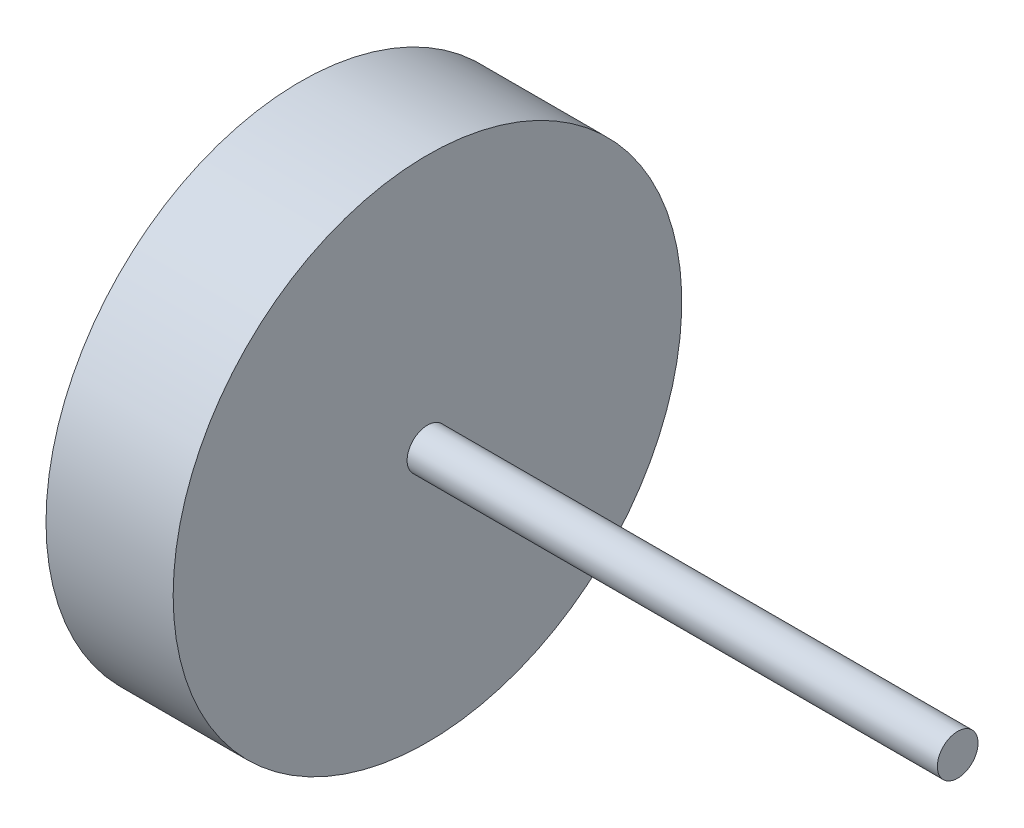
ISO-10303-21;
HEADER;
FILE_DESCRIPTION(('STEP AP214'),'2;1');
FILE_NAME('part.step','',(''),(''),'','','');
FILE_SCHEMA(('AUTOMOTIVE_DESIGN { 1 0 10303 214 1 1 1 1 }'));
ENDSEC;
DATA;
#1=APPLICATION_CONTEXT('core data for automotive mechanical design processes');
#2=APPLICATION_PROTOCOL_DEFINITION('international standard','automotive_design',2000,#1);
#3=PRODUCT_CONTEXT('',#1,'mechanical');
#4=PRODUCT('Part','Part','',(#3));
#5=PRODUCT_RELATED_PRODUCT_CATEGORY('part','',(#4));
#6=PRODUCT_DEFINITION_FORMATION('','',#4);
#7=PRODUCT_DEFINITION_CONTEXT('part definition',#1,'design');
#8=PRODUCT_DEFINITION('design','',#6,#7);
#9=PRODUCT_DEFINITION_SHAPE('','',#8);
#10=(LENGTH_UNIT() NAMED_UNIT(*) SI_UNIT(.MILLI.,.METRE.));
#11=(NAMED_UNIT(*) PLANE_ANGLE_UNIT() SI_UNIT($,.RADIAN.));
#12=(NAMED_UNIT(*) SI_UNIT($,.STERADIAN.) SOLID_ANGLE_UNIT());
#13=UNCERTAINTY_MEASURE_WITH_UNIT(LENGTH_MEASURE(1.E-05),#10,'distance_accuracy_value','');
#14=(GEOMETRIC_REPRESENTATION_CONTEXT(3) GLOBAL_UNCERTAINTY_ASSIGNED_CONTEXT((#13)) GLOBAL_UNIT_ASSIGNED_CONTEXT((#10,
#11,#12)) REPRESENTATION_CONTEXT('',''));
#15=CARTESIAN_POINT('',(0.,0.,0.));
#16=DIRECTION('',(0.,0.,1.));
#17=DIRECTION('',(1.,0.,0.));
#18=AXIS2_PLACEMENT_3D('',#15,#16,#17);
#19=CARTESIAN_POINT('',(-115.25,0.,-252.75));
#20=DIRECTION('',(-1.,0.,0.));
#21=DIRECTION('',(0.,0.,1.));
#22=AXIS2_PLACEMENT_3D('',#19,#20,#21);
#23=CYLINDRICAL_SURFACE('',#22,50.);
#24=CARTESIAN_POINT('',(-115.25,0.,-252.75));
#25=DIRECTION('',(-1.,0.,0.));
#26=DIRECTION('',(0.,0.,1.));
#27=AXIS2_PLACEMENT_3D('',#24,#25,#26);
#28=CIRCLE('',#27,50.);
#29=CARTESIAN_POINT('',(-115.25,0.,-202.75));
#30=VERTEX_POINT('',#29);
#31=EDGE_CURVE('E10',#30,#30,#28,.T.);
#32=ORIENTED_EDGE('',*,*,#31,.T.);
#33=EDGE_LOOP('',(#32));
#34=FACE_BOUND('',#33,.T.);
#35=CARTESIAN_POINT('',(-140.25,0.,-252.75));
#36=DIRECTION('',(-1.,0.,0.));
#37=DIRECTION('',(0.,0.,1.));
#38=AXIS2_PLACEMENT_3D('',#35,#36,#37);
#39=CIRCLE('',#38,50.);
#40=CARTESIAN_POINT('',(-140.25,0.,-202.75));
#41=VERTEX_POINT('',#40);
#42=EDGE_CURVE('E46',#41,#41,#39,.T.);
#43=ORIENTED_EDGE('',*,*,#42,.F.);
#44=EDGE_LOOP('',(#43));
#45=FACE_BOUND('',#44,.T.);
#46=ADVANCED_FACE('F43',(#34,#45),#23,.T.);
#47=CARTESIAN_POINT('',(-115.25,0.,-252.75));
#48=DIRECTION('',(-1.,0.,0.));
#49=DIRECTION('',(0.,0.,1.));
#50=AXIS2_PLACEMENT_3D('',#47,#48,#49);
#51=PLANE('',#50);
#52=CARTESIAN_POINT('',(-115.25,0.,-252.75));
#53=DIRECTION('',(-1.,0.,0.));
#54=DIRECTION('',(0.,0.,1.));
#55=AXIS2_PLACEMENT_3D('',#52,#53,#54);
#56=CIRCLE('',#55,3.99999999999999);
#57=CARTESIAN_POINT('',(-115.25,0.,-248.75));
#58=VERTEX_POINT('',#57);
#59=EDGE_CURVE('E55',#58,#58,#56,.T.);
#60=ORIENTED_EDGE('',*,*,#59,.T.);
#61=EDGE_LOOP('',(#60));
#62=FACE_BOUND('',#61,.T.);
#63=ORIENTED_EDGE('',*,*,#31,.F.);
#64=EDGE_LOOP('',(#63));
#65=FACE_BOUND('',#64,.T.);
#66=ADVANCED_FACE('F77',(#62,#65),#51,.F.);
#67=CARTESIAN_POINT('',(-140.25,0.,-252.75));
#68=DIRECTION('',(-1.,0.,0.));
#69=DIRECTION('',(0.,0.,1.));
#70=AXIS2_PLACEMENT_3D('',#67,#68,#69);
#71=PLANE('',#70);
#72=ORIENTED_EDGE('',*,*,#42,.T.);
#73=EDGE_LOOP('',(#72));
#74=FACE_BOUND('',#73,.T.);
#75=ADVANCED_FACE('F74',(#74),#71,.T.);
#76=CARTESIAN_POINT('',(-11.,0.,-252.75));
#77=DIRECTION('',(-1.,0.,0.));
#78=DIRECTION('',(0.,0.,1.));
#79=AXIS2_PLACEMENT_3D('',#76,#77,#78);
#80=CYLINDRICAL_SURFACE('',#79,3.99999999999999);
#81=CARTESIAN_POINT('',(-11.,0.,-252.75));
#82=DIRECTION('',(-1.,0.,0.));
#83=DIRECTION('',(0.,0.,1.));
#84=AXIS2_PLACEMENT_3D('',#81,#82,#83);
#85=CIRCLE('',#84,3.99999999999999);
#86=CARTESIAN_POINT('',(-11.,0.,-248.75));
#87=VERTEX_POINT('',#86);
#88=EDGE_CURVE('E60',#87,#87,#85,.T.);
#89=ORIENTED_EDGE('',*,*,#88,.T.);
#90=EDGE_LOOP('',(#89));
#91=FACE_BOUND('',#90,.T.);
#92=ORIENTED_EDGE('',*,*,#59,.F.);
#93=EDGE_LOOP('',(#92));
#94=FACE_BOUND('',#93,.T.);
#95=ADVANCED_FACE('F65',(#91,#94),#80,.T.);
#96=CARTESIAN_POINT('',(-11.,0.,-252.75));
#97=DIRECTION('',(-1.,0.,0.));
#98=DIRECTION('',(0.,0.,1.));
#99=AXIS2_PLACEMENT_3D('',#96,#97,#98);
#100=PLANE('',#99);
#101=ORIENTED_EDGE('',*,*,#88,.F.);
#102=EDGE_LOOP('',(#101));
#103=FACE_BOUND('',#102,.T.);
#104=ADVANCED_FACE('F68',(#103),#100,.F.);
#105=CLOSED_SHELL('',(#46,#66,#75,#95,#104));
#106=MANIFOLD_SOLID_BREP('B2',#105);
#107=ADVANCED_BREP_SHAPE_REPRESENTATION('',(#18,#106),#14);
#108=SHAPE_DEFINITION_REPRESENTATION(#9,#107);
ENDSEC;
END-ISO-10303-21;
